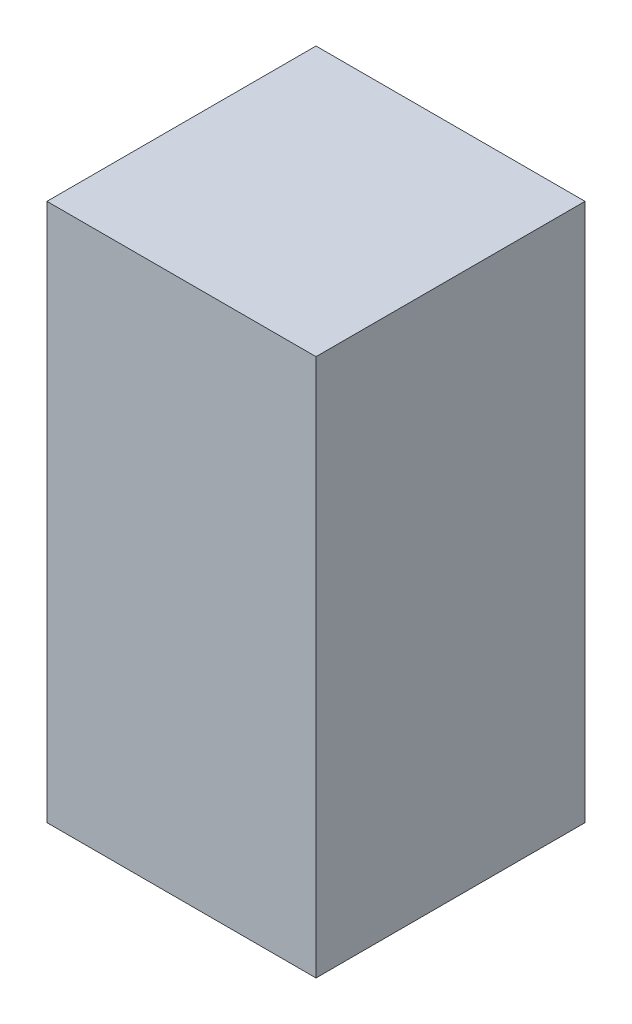
ISO-10303-21;
HEADER;
FILE_DESCRIPTION(('STEP AP214'),'2;1');
FILE_NAME('part.step','',(''),(''),'','','');
FILE_SCHEMA(('AUTOMOTIVE_DESIGN { 1 0 10303 214 1 1 1 1 }'));
ENDSEC;
DATA;
#1=APPLICATION_CONTEXT('core data for automotive mechanical design processes');
#2=APPLICATION_PROTOCOL_DEFINITION('international standard','automotive_design',2000,#1);
#3=PRODUCT_CONTEXT('',#1,'mechanical');
#4=PRODUCT('Part','Part','',(#3));
#5=PRODUCT_RELATED_PRODUCT_CATEGORY('part','',(#4));
#6=PRODUCT_DEFINITION_FORMATION('','',#4);
#7=PRODUCT_DEFINITION_CONTEXT('part definition',#1,'design');
#8=PRODUCT_DEFINITION('design','',#6,#7);
#9=PRODUCT_DEFINITION_SHAPE('','',#8);
#10=(LENGTH_UNIT() NAMED_UNIT(*) SI_UNIT(.MILLI.,.METRE.));
#11=(NAMED_UNIT(*) PLANE_ANGLE_UNIT() SI_UNIT($,.RADIAN.));
#12=(NAMED_UNIT(*) SI_UNIT($,.STERADIAN.) SOLID_ANGLE_UNIT());
#13=UNCERTAINTY_MEASURE_WITH_UNIT(LENGTH_MEASURE(1.E-05),#10,'distance_accuracy_value','');
#14=(GEOMETRIC_REPRESENTATION_CONTEXT(3) GLOBAL_UNCERTAINTY_ASSIGNED_CONTEXT((#13)) GLOBAL_UNIT_ASSIGNED_CONTEXT((#10,
#11,#12)) REPRESENTATION_CONTEXT('',''));
#15=CARTESIAN_POINT('',(0.,0.,0.));
#16=DIRECTION('',(0.,0.,1.));
#17=DIRECTION('',(1.,0.,0.));
#18=AXIS2_PLACEMENT_3D('',#15,#16,#17);
#19=CARTESIAN_POINT('',(0.,20.,0.));
#20=DIRECTION('',(1.,0.,0.));
#21=DIRECTION('',(0.,0.,-1.));
#22=AXIS2_PLACEMENT_3D('',#19,#20,#21);
#23=PLANE('',#22);
#24=DIRECTION('',(0.,0.,1.));
#25=VECTOR('',#24,1.);
#26=CARTESIAN_POINT('',(0.,0.,0.));
#27=LINE('',#26,#25);
#28=CARTESIAN_POINT('',(0.,0.,-10.));
#29=VERTEX_POINT('',#28);
#30=CARTESIAN_POINT('',(0.,0.,0.));
#31=VERTEX_POINT('',#30);
#32=EDGE_CURVE('E96',#29,#31,#27,.T.);
#33=ORIENTED_EDGE('',*,*,#32,.T.);
#34=DIRECTION('',(0.,-1.,0.));
#35=VECTOR('',#34,1.);
#36=CARTESIAN_POINT('',(0.,20.,0.));
#37=LINE('',#36,#35);
#38=CARTESIAN_POINT('',(0.,20.,0.));
#39=VERTEX_POINT('',#38);
#40=EDGE_CURVE('E11',#39,#31,#37,.T.);
#41=ORIENTED_EDGE('',*,*,#40,.F.);
#42=DIRECTION('',(0.,0.,1.));
#43=VECTOR('',#42,1.);
#44=CARTESIAN_POINT('',(0.,20.,0.));
#45=LINE('',#44,#43);
#46=CARTESIAN_POINT('',(0.,20.,-10.));
#47=VERTEX_POINT('',#46);
#48=EDGE_CURVE('E84',#47,#39,#45,.T.);
#49=ORIENTED_EDGE('',*,*,#48,.F.);
#50=DIRECTION('',(0.,-1.,0.));
#51=VECTOR('',#50,1.);
#52=CARTESIAN_POINT('',(0.,20.,-10.));
#53=LINE('',#52,#51);
#54=EDGE_CURVE('E92',#47,#29,#53,.T.);
#55=ORIENTED_EDGE('',*,*,#54,.T.);
#56=EDGE_LOOP('',(#33,#41,#49,#55));
#57=FACE_BOUND('',#56,.T.);
#58=ADVANCED_FACE('F33',(#57),#23,.F.);
#59=CARTESIAN_POINT('',(0.,20.,0.));
#60=DIRECTION('',(0.,0.,-1.));
#61=DIRECTION('',(-1.,0.,0.));
#62=AXIS2_PLACEMENT_3D('',#59,#60,#61);
#63=PLANE('',#62);
#64=DIRECTION('',(1.,0.,0.));
#65=VECTOR('',#64,1.);
#66=CARTESIAN_POINT('',(0.,0.,0.));
#67=LINE('',#66,#65);
#68=CARTESIAN_POINT('',(10.,0.,0.));
#69=VERTEX_POINT('',#68);
#70=EDGE_CURVE('E88',#31,#69,#67,.T.);
#71=ORIENTED_EDGE('',*,*,#70,.T.);
#72=DIRECTION('',(0.,-1.,0.));
#73=VECTOR('',#72,1.);
#74=CARTESIAN_POINT('',(10.,20.,0.));
#75=LINE('',#74,#73);
#76=CARTESIAN_POINT('',(10.,20.,0.));
#77=VERTEX_POINT('',#76);
#78=EDGE_CURVE('E41',#77,#69,#75,.T.);
#79=ORIENTED_EDGE('',*,*,#78,.F.);
#80=DIRECTION('',(1.,0.,0.));
#81=VECTOR('',#80,1.);
#82=CARTESIAN_POINT('',(0.,20.,0.));
#83=LINE('',#82,#81);
#84=EDGE_CURVE('E79',#39,#77,#83,.T.);
#85=ORIENTED_EDGE('',*,*,#84,.F.);
#86=ORIENTED_EDGE('',*,*,#40,.T.);
#87=EDGE_LOOP('',(#71,#79,#85,#86));
#88=FACE_BOUND('',#87,.T.);
#89=ADVANCED_FACE('F87',(#88),#63,.F.);
#90=CARTESIAN_POINT('',(10.,20.,0.));
#91=DIRECTION('',(-1.,0.,0.));
#92=DIRECTION('',(0.,0.,1.));
#93=AXIS2_PLACEMENT_3D('',#90,#91,#92);
#94=PLANE('',#93);
#95=DIRECTION('',(0.,0.,-1.));
#96=VECTOR('',#95,1.);
#97=CARTESIAN_POINT('',(10.,0.,0.));
#98=LINE('',#97,#96);
#99=CARTESIAN_POINT('',(10.,0.,-10.));
#100=VERTEX_POINT('',#99);
#101=EDGE_CURVE('E66',#69,#100,#98,.T.);
#102=ORIENTED_EDGE('',*,*,#101,.T.);
#103=DIRECTION('',(0.,-1.,0.));
#104=VECTOR('',#103,1.);
#105=CARTESIAN_POINT('',(10.,20.,-10.));
#106=LINE('',#105,#104);
#107=CARTESIAN_POINT('',(10.,20.,-10.));
#108=VERTEX_POINT('',#107);
#109=EDGE_CURVE('E89',#108,#100,#106,.T.);
#110=ORIENTED_EDGE('',*,*,#109,.F.);
#111=DIRECTION('',(0.,0.,-1.));
#112=VECTOR('',#111,1.);
#113=CARTESIAN_POINT('',(10.,20.,0.));
#114=LINE('',#113,#112);
#115=EDGE_CURVE('E82',#77,#108,#114,.T.);
#116=ORIENTED_EDGE('',*,*,#115,.F.);
#117=ORIENTED_EDGE('',*,*,#78,.T.);
#118=EDGE_LOOP('',(#102,#110,#116,#117));
#119=FACE_BOUND('',#118,.T.);
#120=ADVANCED_FACE('F90',(#119),#94,.F.);
#121=CARTESIAN_POINT('',(0.,20.,-10.));
#122=DIRECTION('',(0.,0.,1.));
#123=DIRECTION('',(1.,0.,0.));
#124=AXIS2_PLACEMENT_3D('',#121,#122,#123);
#125=PLANE('',#124);
#126=DIRECTION('',(-1.,0.,0.));
#127=VECTOR('',#126,1.);
#128=CARTESIAN_POINT('',(0.,0.,-10.));
#129=LINE('',#128,#127);
#130=EDGE_CURVE('E72',#100,#29,#129,.T.);
#131=ORIENTED_EDGE('',*,*,#130,.T.);
#132=ORIENTED_EDGE('',*,*,#54,.F.);
#133=DIRECTION('',(-1.,0.,0.));
#134=VECTOR('',#133,1.);
#135=CARTESIAN_POINT('',(0.,20.,-10.));
#136=LINE('',#135,#134);
#137=EDGE_CURVE('E49',#108,#47,#136,.T.);
#138=ORIENTED_EDGE('',*,*,#137,.F.);
#139=ORIENTED_EDGE('',*,*,#109,.T.);
#140=EDGE_LOOP('',(#131,#132,#138,#139));
#141=FACE_BOUND('',#140,.T.);
#142=ADVANCED_FACE('F103',(#141),#125,.F.);
#143=CARTESIAN_POINT('',(0.,20.,0.));
#144=DIRECTION('',(0.,-1.,0.));
#145=DIRECTION('',(0.,0.,-1.));
#146=AXIS2_PLACEMENT_3D('',#143,#144,#145);
#147=PLANE('',#146);
#148=ORIENTED_EDGE('',*,*,#48,.T.);
#149=ORIENTED_EDGE('',*,*,#84,.T.);
#150=ORIENTED_EDGE('',*,*,#115,.T.);
#151=ORIENTED_EDGE('',*,*,#137,.T.);
#152=EDGE_LOOP('',(#148,#149,#150,#151));
#153=FACE_BOUND('',#152,.T.);
#154=ADVANCED_FACE('F80',(#153),#147,.F.);
#155=CARTESIAN_POINT('',(0.,0.,0.));
#156=DIRECTION('',(0.,-1.,0.));
#157=DIRECTION('',(0.,0.,-1.));
#158=AXIS2_PLACEMENT_3D('',#155,#156,#157);
#159=PLANE('',#158);
#160=ORIENTED_EDGE('',*,*,#32,.F.);
#161=ORIENTED_EDGE('',*,*,#130,.F.);
#162=ORIENTED_EDGE('',*,*,#101,.F.);
#163=ORIENTED_EDGE('',*,*,#70,.F.);
#164=EDGE_LOOP('',(#160,#161,#162,#163));
#165=FACE_BOUND('',#164,.T.);
#166=ADVANCED_FACE('F106',(#165),#159,.T.);
#167=CLOSED_SHELL('',(#58,#89,#120,#142,#154,#166));
#168=MANIFOLD_SOLID_BREP('B2',#167);
#169=ADVANCED_BREP_SHAPE_REPRESENTATION('',(#18,#168),#14);
#170=SHAPE_DEFINITION_REPRESENTATION(#9,#169);
ENDSEC;
END-ISO-10303-21;
